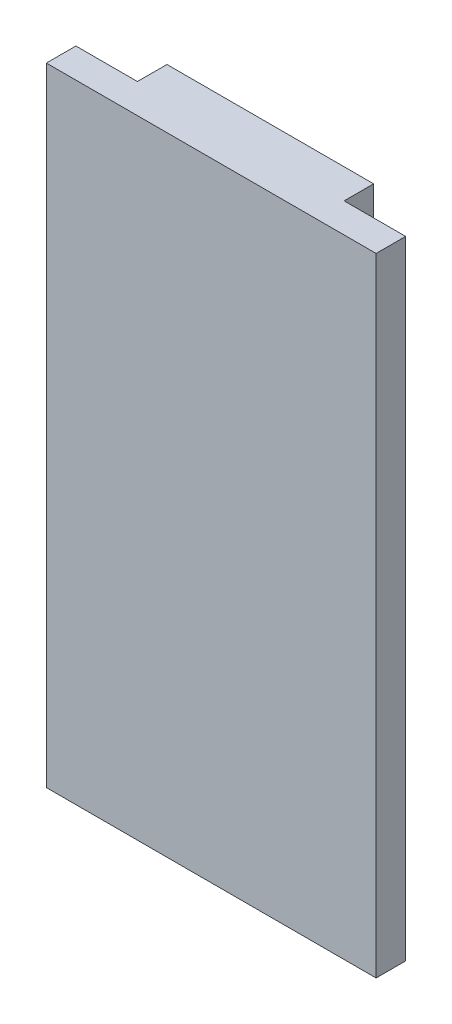
ISO-10303-21;
HEADER;
FILE_DESCRIPTION(('STEP AP214'),'2;1');
FILE_NAME('part.step','',(''),(''),'','','');
FILE_SCHEMA(('AUTOMOTIVE_DESIGN { 1 0 10303 214 1 1 1 1 }'));
ENDSEC;
DATA;
#1=APPLICATION_CONTEXT('core data for automotive mechanical design processes');
#2=APPLICATION_PROTOCOL_DEFINITION('international standard','automotive_design',2000,#1);
#3=PRODUCT_CONTEXT('',#1,'mechanical');
#4=PRODUCT('Part','Part','',(#3));
#5=PRODUCT_RELATED_PRODUCT_CATEGORY('part','',(#4));
#6=PRODUCT_DEFINITION_FORMATION('','',#4);
#7=PRODUCT_DEFINITION_CONTEXT('part definition',#1,'design');
#8=PRODUCT_DEFINITION('design','',#6,#7);
#9=PRODUCT_DEFINITION_SHAPE('','',#8);
#10=(LENGTH_UNIT() NAMED_UNIT(*) SI_UNIT(.MILLI.,.METRE.));
#11=(NAMED_UNIT(*) PLANE_ANGLE_UNIT() SI_UNIT($,.RADIAN.));
#12=(NAMED_UNIT(*) SI_UNIT($,.STERADIAN.) SOLID_ANGLE_UNIT());
#13=UNCERTAINTY_MEASURE_WITH_UNIT(LENGTH_MEASURE(1.E-05),#10,'distance_accuracy_value','');
#14=(GEOMETRIC_REPRESENTATION_CONTEXT(3) GLOBAL_UNCERTAINTY_ASSIGNED_CONTEXT((#13)) GLOBAL_UNIT_ASSIGNED_CONTEXT((#10,
#11,#12)) REPRESENTATION_CONTEXT('',''));
#15=CARTESIAN_POINT('',(0.,0.,0.));
#16=DIRECTION('',(0.,0.,1.));
#17=DIRECTION('',(1.,0.,0.));
#18=AXIS2_PLACEMENT_3D('',#15,#16,#17);
#19=CARTESIAN_POINT('',(266.7,-809.624999999999,76.2));
#20=DIRECTION('',(-1.,0.,0.));
#21=DIRECTION('',(0.,0.,1.));
#22=AXIS2_PLACEMENT_3D('',#19,#20,#21);
#23=PLANE('',#22);
#24=DIRECTION('',(0.,1.,0.));
#25=VECTOR('',#24,1.);
#26=CARTESIAN_POINT('',(266.7,-809.624999999999,0.));
#27=LINE('',#26,#25);
#28=CARTESIAN_POINT('',(266.7,-809.624999999999,0.));
#29=VERTEX_POINT('',#28);
#30=CARTESIAN_POINT('',(266.7,809.625000000001,0.));
#31=VERTEX_POINT('',#30);
#32=EDGE_CURVE('E139',#29,#31,#27,.T.);
#33=ORIENTED_EDGE('',*,*,#32,.T.);
#34=DIRECTION('',(0.,0.,-1.));
#35=VECTOR('',#34,1.);
#36=CARTESIAN_POINT('',(266.7,809.625000000001,76.2));
#37=LINE('',#36,#35);
#38=CARTESIAN_POINT('',(266.7,809.625000000001,76.2));
#39=VERTEX_POINT('',#38);
#40=EDGE_CURVE('E11',#39,#31,#37,.T.);
#41=ORIENTED_EDGE('',*,*,#40,.F.);
#42=DIRECTION('',(0.,1.,0.));
#43=VECTOR('',#42,1.);
#44=CARTESIAN_POINT('',(266.7,-809.624999999999,76.2));
#45=LINE('',#44,#43);
#46=CARTESIAN_POINT('',(266.7,-809.624999999999,76.2));
#47=VERTEX_POINT('',#46);
#48=EDGE_CURVE('E149',#47,#39,#45,.T.);
#49=ORIENTED_EDGE('',*,*,#48,.F.);
#50=DIRECTION('',(0.,0.,-1.));
#51=VECTOR('',#50,1.);
#52=CARTESIAN_POINT('',(266.7,-809.624999999999,76.2));
#53=LINE('',#52,#51);
#54=EDGE_CURVE('E56',#47,#29,#53,.T.);
#55=ORIENTED_EDGE('',*,*,#54,.T.);
#56=EDGE_LOOP('',(#33,#41,#49,#55));
#57=FACE_BOUND('',#56,.T.);
#58=ADVANCED_FACE('F39',(#57),#23,.F.);
#59=CARTESIAN_POINT('',(-266.7,809.625000000001,76.2));
#60=DIRECTION('',(0.,-1.,0.));
#61=DIRECTION('',(0.,0.,-1.));
#62=AXIS2_PLACEMENT_3D('',#59,#60,#61);
#63=PLANE('',#62);
#64=DIRECTION('',(-1.,0.,0.));
#65=VECTOR('',#64,1.);
#66=CARTESIAN_POINT('',(-266.7,809.625000000001,0.));
#67=LINE('',#66,#65);
#68=CARTESIAN_POINT('',(-266.7,809.625000000001,0.));
#69=VERTEX_POINT('',#68);
#70=EDGE_CURVE('E143',#31,#69,#67,.T.);
#71=ORIENTED_EDGE('',*,*,#70,.T.);
#72=DIRECTION('',(0.,0.,-1.));
#73=VECTOR('',#72,1.);
#74=CARTESIAN_POINT('',(-266.7,809.625000000001,76.2));
#75=LINE('',#74,#73);
#76=CARTESIAN_POINT('',(-266.7,809.625000000001,76.2));
#77=VERTEX_POINT('',#76);
#78=EDGE_CURVE('E48',#77,#69,#75,.T.);
#79=ORIENTED_EDGE('',*,*,#78,.F.);
#80=DIRECTION('',(-1.,0.,0.));
#81=VECTOR('',#80,1.);
#82=CARTESIAN_POINT('',(-425.45,809.624999999999,76.2));
#83=LINE('',#82,#81);
#84=CARTESIAN_POINT('',(-425.45,809.624999999999,76.2));
#85=VERTEX_POINT('',#84);
#86=EDGE_CURVE('E198',#77,#85,#83,.T.);
#87=ORIENTED_EDGE('',*,*,#86,.T.);
#88=DIRECTION('',(0.,0.,-1.));
#89=VECTOR('',#88,1.);
#90=CARTESIAN_POINT('',(-425.45,809.624999999999,152.4));
#91=LINE('',#90,#89);
#92=CARTESIAN_POINT('',(-425.45,809.624999999999,152.4));
#93=VERTEX_POINT('',#92);
#94=EDGE_CURVE('E118',#93,#85,#91,.T.);
#95=ORIENTED_EDGE('',*,*,#94,.F.);
#96=DIRECTION('',(-1.,0.,0.));
#97=VECTOR('',#96,1.);
#98=CARTESIAN_POINT('',(-425.45,809.624999999999,152.4));
#99=LINE('',#98,#97);
#100=CARTESIAN_POINT('',(425.45,809.624999999999,152.4));
#101=VERTEX_POINT('',#100);
#102=EDGE_CURVE('E110',#101,#93,#99,.T.);
#103=ORIENTED_EDGE('',*,*,#102,.F.);
#104=DIRECTION('',(0.,0.,-1.));
#105=VECTOR('',#104,1.);
#106=CARTESIAN_POINT('',(425.45,809.624999999999,152.4));
#107=LINE('',#106,#105);
#108=CARTESIAN_POINT('',(425.45,809.624999999999,76.2));
#109=VERTEX_POINT('',#108);
#110=EDGE_CURVE('E115',#101,#109,#107,.T.);
#111=ORIENTED_EDGE('',*,*,#110,.T.);
#112=EDGE_CURVE('E183',#109,#39,#83,.T.);
#113=ORIENTED_EDGE('',*,*,#112,.T.);
#114=ORIENTED_EDGE('',*,*,#40,.T.);
#115=EDGE_LOOP('',(#71,#79,#87,#95,#103,#111,#113,#114));
#116=FACE_BOUND('',#115,.T.);
#117=ADVANCED_FACE('F112',(#116),#63,.F.);
#118=CARTESIAN_POINT('',(-266.7,-809.624999999999,76.2));
#119=DIRECTION('',(1.,0.,0.));
#120=DIRECTION('',(0.,0.,-1.));
#121=AXIS2_PLACEMENT_3D('',#118,#119,#120);
#122=PLANE('',#121);
#123=DIRECTION('',(0.,-1.,0.));
#124=VECTOR('',#123,1.);
#125=CARTESIAN_POINT('',(-266.7,-809.624999999999,0.));
#126=LINE('',#125,#124);
#127=CARTESIAN_POINT('',(-266.7,-809.624999999999,0.));
#128=VERTEX_POINT('',#127);
#129=EDGE_CURVE('E75',#69,#128,#126,.T.);
#130=ORIENTED_EDGE('',*,*,#129,.T.);
#131=DIRECTION('',(0.,0.,-1.));
#132=VECTOR('',#131,1.);
#133=CARTESIAN_POINT('',(-266.7,-809.624999999999,76.2));
#134=LINE('',#133,#132);
#135=CARTESIAN_POINT('',(-266.7,-809.624999999999,76.2));
#136=VERTEX_POINT('',#135);
#137=EDGE_CURVE('E164',#136,#128,#134,.T.);
#138=ORIENTED_EDGE('',*,*,#137,.F.);
#139=DIRECTION('',(0.,-1.,0.));
#140=VECTOR('',#139,1.);
#141=CARTESIAN_POINT('',(-266.7,-809.624999999999,76.2));
#142=LINE('',#141,#140);
#143=EDGE_CURVE('E152',#77,#136,#142,.T.);
#144=ORIENTED_EDGE('',*,*,#143,.F.);
#145=ORIENTED_EDGE('',*,*,#78,.T.);
#146=EDGE_LOOP('',(#130,#138,#144,#145));
#147=FACE_BOUND('',#146,.T.);
#148=ADVANCED_FACE('F168',(#147),#122,.F.);
#149=CARTESIAN_POINT('',(-266.7,-809.624999999999,76.2));
#150=DIRECTION('',(0.,1.,0.));
#151=DIRECTION('',(0.,0.,1.));
#152=AXIS2_PLACEMENT_3D('',#149,#150,#151);
#153=PLANE('',#152);
#154=DIRECTION('',(1.,0.,0.));
#155=VECTOR('',#154,1.);
#156=CARTESIAN_POINT('',(-266.7,-809.624999999999,0.));
#157=LINE('',#156,#155);
#158=EDGE_CURVE('E78',#128,#29,#157,.T.);
#159=ORIENTED_EDGE('',*,*,#158,.T.);
#160=ORIENTED_EDGE('',*,*,#54,.F.);
#161=DIRECTION('',(1.,0.,0.));
#162=VECTOR('',#161,1.);
#163=CARTESIAN_POINT('',(-425.45,-809.624999999999,76.2));
#164=LINE('',#163,#162);
#165=CARTESIAN_POINT('',(425.45,-809.624999999999,76.2));
#166=VERTEX_POINT('',#165);
#167=EDGE_CURVE('E175',#47,#166,#164,.T.);
#168=ORIENTED_EDGE('',*,*,#167,.T.);
#169=DIRECTION('',(0.,0.,-1.));
#170=VECTOR('',#169,1.);
#171=CARTESIAN_POINT('',(425.45,-809.624999999999,152.4));
#172=LINE('',#171,#170);
#173=CARTESIAN_POINT('',(425.45,-809.624999999999,152.4));
#174=VERTEX_POINT('',#173);
#175=EDGE_CURVE('E187',#174,#166,#172,.T.);
#176=ORIENTED_EDGE('',*,*,#175,.F.);
#177=DIRECTION('',(1.,0.,0.));
#178=VECTOR('',#177,1.);
#179=CARTESIAN_POINT('',(-425.45,-809.624999999999,152.4));
#180=LINE('',#179,#178);
#181=CARTESIAN_POINT('',(-425.45,-809.624999999999,152.4));
#182=VERTEX_POINT('',#181);
#183=EDGE_CURVE('E128',#182,#174,#180,.T.);
#184=ORIENTED_EDGE('',*,*,#183,.F.);
#185=DIRECTION('',(0.,0.,-1.));
#186=VECTOR('',#185,1.);
#187=CARTESIAN_POINT('',(-425.45,-809.624999999999,152.4));
#188=LINE('',#187,#186);
#189=CARTESIAN_POINT('',(-425.45,-809.624999999999,76.2));
#190=VERTEX_POINT('',#189);
#191=EDGE_CURVE('E145',#182,#190,#188,.T.);
#192=ORIENTED_EDGE('',*,*,#191,.T.);
#193=EDGE_CURVE('E133',#190,#136,#164,.T.);
#194=ORIENTED_EDGE('',*,*,#193,.T.);
#195=ORIENTED_EDGE('',*,*,#137,.T.);
#196=EDGE_LOOP('',(#159,#160,#168,#176,#184,#192,#194,#195));
#197=FACE_BOUND('',#196,.T.);
#198=ADVANCED_FACE('F193',(#197),#153,.F.);
#199=CARTESIAN_POINT('',(0.,0.,0.));
#200=DIRECTION('',(0.,0.,-1.));
#201=DIRECTION('',(-1.,0.,0.));
#202=AXIS2_PLACEMENT_3D('',#199,#200,#201);
#203=PLANE('',#202);
#204=ORIENTED_EDGE('',*,*,#32,.F.);
#205=ORIENTED_EDGE('',*,*,#158,.F.);
#206=ORIENTED_EDGE('',*,*,#129,.F.);
#207=ORIENTED_EDGE('',*,*,#70,.F.);
#208=EDGE_LOOP('',(#204,#205,#206,#207));
#209=FACE_BOUND('',#208,.T.);
#210=ADVANCED_FACE('F172',(#209),#203,.T.);
#211=CARTESIAN_POINT('',(0.,0.,76.2));
#212=DIRECTION('',(0.,0.,1.));
#213=DIRECTION('',(1.,0.,0.));
#214=AXIS2_PLACEMENT_3D('',#211,#212,#213);
#215=PLANE('',#214);
#216=ORIENTED_EDGE('',*,*,#167,.F.);
#217=ORIENTED_EDGE('',*,*,#48,.T.);
#218=ORIENTED_EDGE('',*,*,#112,.F.);
#219=DIRECTION('',(0.,1.,0.));
#220=VECTOR('',#219,1.);
#221=CARTESIAN_POINT('',(425.45,809.624999999999,76.2));
#222=LINE('',#221,#220);
#223=EDGE_CURVE('E137',#166,#109,#222,.T.);
#224=ORIENTED_EDGE('',*,*,#223,.F.);
#225=EDGE_LOOP('',(#216,#217,#218,#224));
#226=FACE_BOUND('',#225,.T.);
#227=ADVANCED_FACE('F176',(#226),#215,.F.);
#228=ORIENTED_EDGE('',*,*,#86,.F.);
#229=ORIENTED_EDGE('',*,*,#143,.T.);
#230=ORIENTED_EDGE('',*,*,#193,.F.);
#231=DIRECTION('',(0.,-1.,0.));
#232=VECTOR('',#231,1.);
#233=CARTESIAN_POINT('',(-425.45,809.624999999999,76.2));
#234=LINE('',#233,#232);
#235=EDGE_CURVE('E178',#85,#190,#234,.T.);
#236=ORIENTED_EDGE('',*,*,#235,.F.);
#237=EDGE_LOOP('',(#228,#229,#230,#236));
#238=FACE_BOUND('',#237,.T.);
#239=ADVANCED_FACE('F197',(#238),#215,.F.);
#240=CARTESIAN_POINT('',(425.45,809.624999999999,152.4));
#241=DIRECTION('',(-1.,0.,0.));
#242=DIRECTION('',(0.,-1.,0.));
#243=AXIS2_PLACEMENT_3D('',#240,#241,#242);
#244=PLANE('',#243);
#245=ORIENTED_EDGE('',*,*,#223,.T.);
#246=ORIENTED_EDGE('',*,*,#110,.F.);
#247=DIRECTION('',(0.,1.,0.));
#248=VECTOR('',#247,1.);
#249=CARTESIAN_POINT('',(425.45,809.624999999999,152.4));
#250=LINE('',#249,#248);
#251=EDGE_CURVE('E123',#174,#101,#250,.T.);
#252=ORIENTED_EDGE('',*,*,#251,.F.);
#253=ORIENTED_EDGE('',*,*,#175,.T.);
#254=EDGE_LOOP('',(#245,#246,#252,#253));
#255=FACE_BOUND('',#254,.T.);
#256=ADVANCED_FACE('F135',(#255),#244,.F.);
#257=CARTESIAN_POINT('',(-425.45,809.624999999999,152.4));
#258=DIRECTION('',(1.,0.,0.));
#259=DIRECTION('',(0.,1.,0.));
#260=AXIS2_PLACEMENT_3D('',#257,#258,#259);
#261=PLANE('',#260);
#262=ORIENTED_EDGE('',*,*,#235,.T.);
#263=ORIENTED_EDGE('',*,*,#191,.F.);
#264=DIRECTION('',(0.,-1.,0.));
#265=VECTOR('',#264,1.);
#266=CARTESIAN_POINT('',(-425.45,809.624999999999,152.4));
#267=LINE('',#266,#265);
#268=EDGE_CURVE('E122',#93,#182,#267,.T.);
#269=ORIENTED_EDGE('',*,*,#268,.F.);
#270=ORIENTED_EDGE('',*,*,#94,.T.);
#271=EDGE_LOOP('',(#262,#263,#269,#270));
#272=FACE_BOUND('',#271,.T.);
#273=ADVANCED_FACE('F207',(#272),#261,.F.);
#274=CARTESIAN_POINT('',(0.,0.,152.4));
#275=DIRECTION('',(0.,0.,1.));
#276=DIRECTION('',(1.,0.,0.));
#277=AXIS2_PLACEMENT_3D('',#274,#275,#276);
#278=PLANE('',#277);
#279=ORIENTED_EDGE('',*,*,#251,.T.);
#280=ORIENTED_EDGE('',*,*,#102,.T.);
#281=ORIENTED_EDGE('',*,*,#268,.T.);
#282=ORIENTED_EDGE('',*,*,#183,.T.);
#283=EDGE_LOOP('',(#279,#280,#281,#282));
#284=FACE_BOUND('',#283,.T.);
#285=ADVANCED_FACE('F126',(#284),#278,.T.);
#286=CLOSED_SHELL('',(#58,#117,#148,#198,#210,#227,#239,#256,#273,#285));
#287=MANIFOLD_SOLID_BREP('B2',#286);
#288=ADVANCED_BREP_SHAPE_REPRESENTATION('',(#18,#287),#14);
#289=SHAPE_DEFINITION_REPRESENTATION(#9,#288);
ENDSEC;
END-ISO-10303-21;
